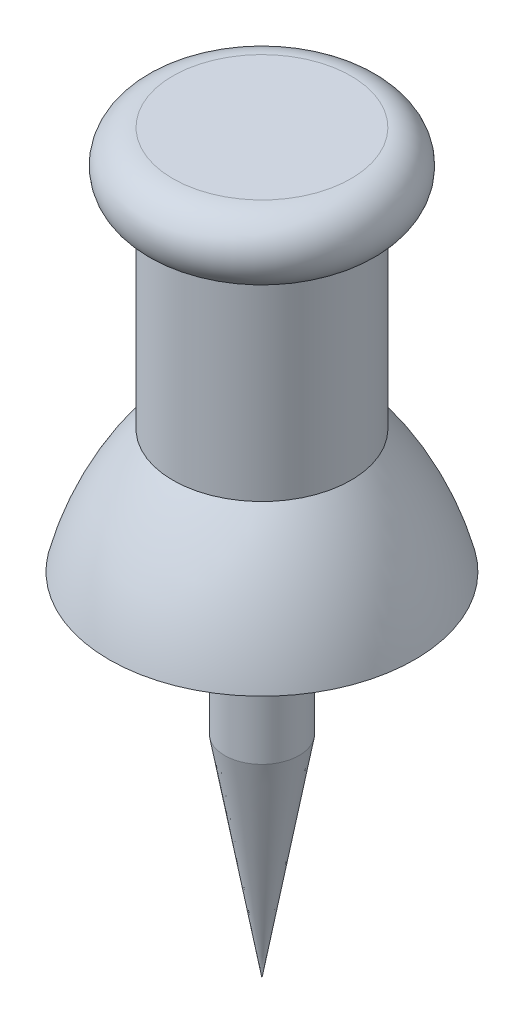
ISO-10303-21;
HEADER;
FILE_DESCRIPTION(('STEP AP214'),'2;1');
FILE_NAME('part.step','',(''),(''),'','','');
FILE_SCHEMA(('AUTOMOTIVE_DESIGN { 1 0 10303 214 1 1 1 1 }'));
ENDSEC;
DATA;
#1=APPLICATION_CONTEXT('core data for automotive mechanical design processes');
#2=APPLICATION_PROTOCOL_DEFINITION('international standard','automotive_design',2000,#1);
#3=PRODUCT_CONTEXT('',#1,'mechanical');
#4=PRODUCT('Part','Part','',(#3));
#5=PRODUCT_RELATED_PRODUCT_CATEGORY('part','',(#4));
#6=PRODUCT_DEFINITION_FORMATION('','',#4);
#7=PRODUCT_DEFINITION_CONTEXT('part definition',#1,'design');
#8=PRODUCT_DEFINITION('design','',#6,#7);
#9=PRODUCT_DEFINITION_SHAPE('','',#8);
#10=(LENGTH_UNIT() NAMED_UNIT(*) SI_UNIT(.MILLI.,.METRE.));
#11=(NAMED_UNIT(*) PLANE_ANGLE_UNIT() SI_UNIT($,.RADIAN.));
#12=(NAMED_UNIT(*) SI_UNIT($,.STERADIAN.) SOLID_ANGLE_UNIT());
#13=UNCERTAINTY_MEASURE_WITH_UNIT(LENGTH_MEASURE(1.E-05),#10,'distance_accuracy_value','');
#14=(GEOMETRIC_REPRESENTATION_CONTEXT(3) GLOBAL_UNCERTAINTY_ASSIGNED_CONTEXT((#13)) GLOBAL_UNIT_ASSIGNED_CONTEXT((#10,
#11,#12)) REPRESENTATION_CONTEXT('',''));
#15=CARTESIAN_POINT('',(0.,0.,0.));
#16=DIRECTION('',(0.,0.,1.));
#17=DIRECTION('',(1.,0.,0.));
#18=AXIS2_PLACEMENT_3D('',#15,#16,#17);
#19=CARTESIAN_POINT('',(0.,36.6036552350621,0.));
#20=DIRECTION('',(0.,1.,0.));
#21=DIRECTION('',(0.,0.,1.));
#22=AXIS2_PLACEMENT_3D('',#19,#20,#21);
#23=PLANE('',#22);
#24=CARTESIAN_POINT('',(0.,36.6036552350621,0.));
#25=DIRECTION('',(0.,1.,0.));
#26=DIRECTION('',(0.,0.,1.));
#27=AXIS2_PLACEMENT_3D('',#24,#25,#26);
#28=CIRCLE('',#27,3.37305223588491);
#29=CARTESIAN_POINT('',(0.,36.6036552350621,3.37305223588491));
#30=VERTEX_POINT('',#29);
#31=EDGE_CURVE('E11',#30,#30,#28,.T.);
#32=ORIENTED_EDGE('',*,*,#31,.T.);
#33=EDGE_LOOP('',(#32));
#34=FACE_BOUND('',#33,.T.);
#35=ADVANCED_FACE('F31',(#34),#23,.T.);
#36=CARTESIAN_POINT('',(0.,35.3515904860706,0.));
#37=DIRECTION('',(0.,1.,0.));
#38=DIRECTION('',(0.,0.,1.));
#39=AXIS2_PLACEMENT_3D('',#36,#37,#38);
#40=TOROIDAL_SURFACE('',#39,3.37305223588491,1.25206474899153);
#41=CARTESIAN_POINT('',(0.,34.0995257370791,0.));
#42=DIRECTION('',(0.,1.,0.));
#43=DIRECTION('',(0.,0.,1.));
#44=AXIS2_PLACEMENT_3D('',#41,#42,#43);
#45=CIRCLE('',#44,3.37305223588491);
#46=CARTESIAN_POINT('',(0.,34.0995257370791,3.37305223588491));
#47=VERTEX_POINT('',#46);
#48=EDGE_CURVE('E37',#47,#47,#45,.T.);
#49=ORIENTED_EDGE('',*,*,#48,.T.);
#50=EDGE_LOOP('',(#49));
#51=FACE_BOUND('',#50,.T.);
#52=ORIENTED_EDGE('',*,*,#31,.F.);
#53=EDGE_LOOP('',(#52));
#54=FACE_BOUND('',#53,.T.);
#55=ADVANCED_FACE('F62',(#51,#54),#40,.T.);
#56=CARTESIAN_POINT('',(0.,41.7891223733004,0.));
#57=DIRECTION('',(0.,1.,0.));
#58=DIRECTION('',(0.,0.,1.));
#59=AXIS2_PLACEMENT_3D('',#56,#57,#58);
#60=CYLINDRICAL_SURFACE('',#59,3.37305223588491);
#61=CARTESIAN_POINT('',(0.,26.7142974416699,0.));
#62=DIRECTION('',(0.,1.,0.));
#63=DIRECTION('',(0.,0.,1.));
#64=AXIS2_PLACEMENT_3D('',#61,#62,#63);
#65=CIRCLE('',#64,3.37305223588491);
#66=CARTESIAN_POINT('',(0.,26.7142974416699,3.37305223588491));
#67=VERTEX_POINT('',#66);
#68=EDGE_CURVE('E57',#67,#67,#65,.T.);
#69=ORIENTED_EDGE('',*,*,#68,.T.);
#70=EDGE_LOOP('',(#69));
#71=FACE_BOUND('',#70,.T.);
#72=ORIENTED_EDGE('',*,*,#48,.F.);
#73=EDGE_LOOP('',(#72));
#74=FACE_BOUND('',#73,.T.);
#75=ADVANCED_FACE('F65',(#71,#74),#60,.T.);
#76=CARTESIAN_POINT('',(0.,19.1853949164798,0.));
#77=DIRECTION('',(0.,1.,0.));
#78=DIRECTION('',(0.,0.,1.));
#79=AXIS2_PLACEMENT_3D('',#76,#77,#78);
#80=DEGENERATE_TOROIDAL_SURFACE('',#79,5.4948538071979,11.6328900460186,.F.);
#81=CARTESIAN_POINT('',(0.,22.0349366872976,0.));
#82=DIRECTION('',(0.,1.,0.));
#83=DIRECTION('',(0.,0.,1.));
#84=AXIS2_PLACEMENT_3D('',#81,#82,#83);
#85=CIRCLE('',#84,5.78363201844035);
#86=CARTESIAN_POINT('',(0.,22.0349366872976,5.78363201844035));
#87=VERTEX_POINT('',#86);
#88=EDGE_CURVE('E52',#87,#87,#85,.T.);
#89=ORIENTED_EDGE('',*,*,#88,.T.);
#90=EDGE_LOOP('',(#89));
#91=FACE_BOUND('',#90,.T.);
#92=ORIENTED_EDGE('',*,*,#68,.F.);
#93=EDGE_LOOP('',(#92));
#94=FACE_BOUND('',#93,.T.);
#95=ADVANCED_FACE('F67',(#91,#94),#80,.F.);
#96=CARTESIAN_POINT('',(-5.78363201844035,22.0349366872976,0.));
#97=DIRECTION('',(0.,-1.,0.));
#98=DIRECTION('',(0.,0.,-1.));
#99=AXIS2_PLACEMENT_3D('',#96,#97,#98);
#100=PLANE('',#99);
#101=CARTESIAN_POINT('',(0.,22.0349366872976,0.));
#102=DIRECTION('',(0.,1.,0.));
#103=DIRECTION('',(0.,0.,1.));
#104=AXIS2_PLACEMENT_3D('',#101,#102,#103);
#105=CIRCLE('',#104,1.41089679587547);
#106=CARTESIAN_POINT('',(0.,22.0349366872976,1.41089679587547));
#107=VERTEX_POINT('',#106);
#108=EDGE_CURVE('E49',#107,#107,#105,.T.);
#109=ORIENTED_EDGE('',*,*,#108,.T.);
#110=EDGE_LOOP('',(#109));
#111=FACE_BOUND('',#110,.T.);
#112=ORIENTED_EDGE('',*,*,#88,.F.);
#113=EDGE_LOOP('',(#112));
#114=FACE_BOUND('',#113,.T.);
#115=ADVANCED_FACE('F74',(#111,#114),#100,.T.);
#116=CARTESIAN_POINT('',(0.,41.7891223733004,0.));
#117=DIRECTION('',(0.,1.,0.));
#118=DIRECTION('',(0.,0.,1.));
#119=AXIS2_PLACEMENT_3D('',#116,#117,#118);
#120=CYLINDRICAL_SURFACE('',#119,1.41089679587547);
#121=CARTESIAN_POINT('',(0.,16.7086976958698,0.));
#122=DIRECTION('',(0.,1.,0.));
#123=DIRECTION('',(0.,0.,1.));
#124=AXIS2_PLACEMENT_3D('',#121,#122,#123);
#125=CIRCLE('',#124,1.41089679587547);
#126=CARTESIAN_POINT('',(0.,16.7086976958698,1.41089679587547));
#127=VERTEX_POINT('',#126);
#128=EDGE_CURVE('E47',#127,#127,#125,.T.);
#129=ORIENTED_EDGE('',*,*,#128,.T.);
#130=EDGE_LOOP('',(#129));
#131=FACE_BOUND('',#130,.T.);
#132=ORIENTED_EDGE('',*,*,#108,.F.);
#133=EDGE_LOOP('',(#132));
#134=FACE_BOUND('',#133,.T.);
#135=ADVANCED_FACE('F43',(#131,#134),#120,.T.);
#136=CARTESIAN_POINT('',(0.,16.7086976958698,0.));
#137=DIRECTION('',(0.,1.,0.));
#138=DIRECTION('',(0.,0.,1.));
#139=AXIS2_PLACEMENT_3D('',#136,#137,#138);
#140=CONICAL_SURFACE('',#139,1.41089679587547,0.174506088823823);
#141=CARTESIAN_POINT('',(0.,8.7058484778734,0.));
#142=VERTEX_POINT('',#141);
#143=VERTEX_LOOP('',#142);
#144=FACE_BOUND('',#143,.T.);
#145=ORIENTED_EDGE('',*,*,#128,.F.);
#146=EDGE_LOOP('',(#145));
#147=FACE_BOUND('',#146,.T.);
#148=ADVANCED_FACE('F40',(#144,#147),#140,.T.);
#149=CLOSED_SHELL('',(#35,#55,#75,#95,#115,#135,#148));
#150=MANIFOLD_SOLID_BREP('B2',#149);
#151=ADVANCED_BREP_SHAPE_REPRESENTATION('',(#18,#150),#14);
#152=SHAPE_DEFINITION_REPRESENTATION(#9,#151);
ENDSEC;
END-ISO-10303-21;
